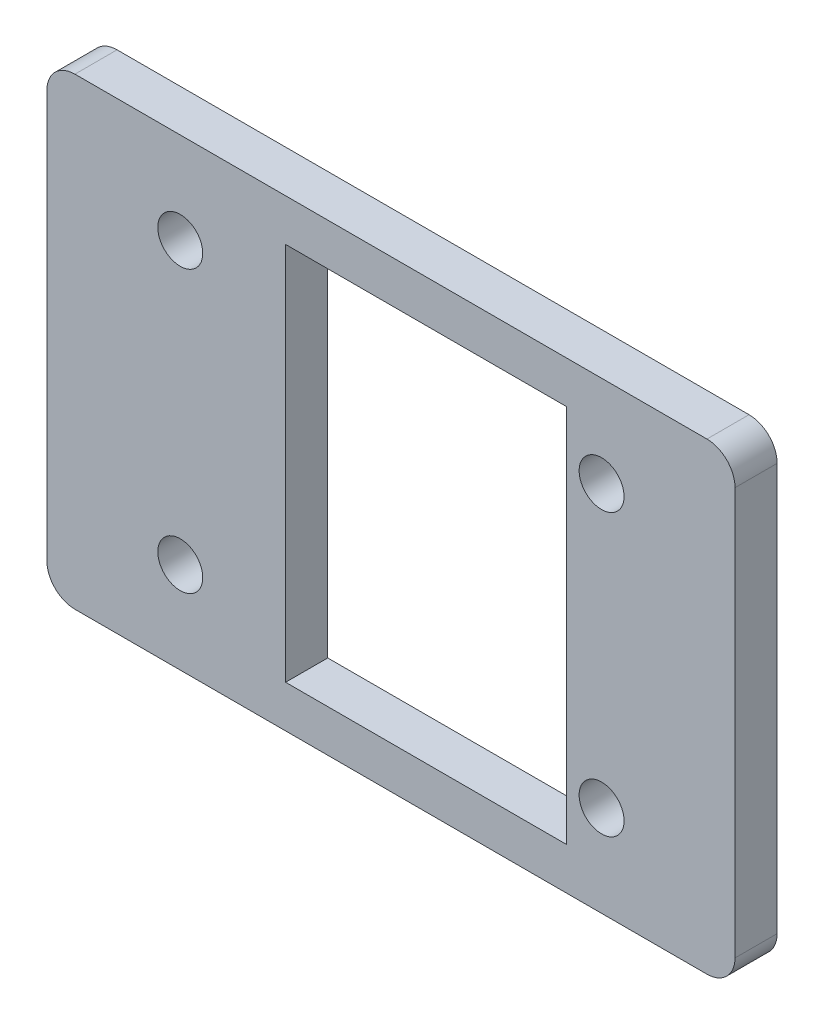
ISO-10303-21;
HEADER;
FILE_DESCRIPTION(('STEP AP214'),'2;1');
FILE_NAME('part.step','',(''),(''),'','','');
FILE_SCHEMA(('AUTOMOTIVE_DESIGN { 1 0 10303 214 1 1 1 1 }'));
ENDSEC;
DATA;
#1=APPLICATION_CONTEXT('core data for automotive mechanical design processes');
#2=APPLICATION_PROTOCOL_DEFINITION('international standard','automotive_design',2000,#1);
#3=PRODUCT_CONTEXT('',#1,'mechanical');
#4=PRODUCT('Part','Part','',(#3));
#5=PRODUCT_RELATED_PRODUCT_CATEGORY('part','',(#4));
#6=PRODUCT_DEFINITION_FORMATION('','',#4);
#7=PRODUCT_DEFINITION_CONTEXT('part definition',#1,'design');
#8=PRODUCT_DEFINITION('design','',#6,#7);
#9=PRODUCT_DEFINITION_SHAPE('','',#8);
#10=(LENGTH_UNIT() NAMED_UNIT(*) SI_UNIT(.MILLI.,.METRE.));
#11=(NAMED_UNIT(*) PLANE_ANGLE_UNIT() SI_UNIT($,.RADIAN.));
#12=(NAMED_UNIT(*) SI_UNIT($,.STERADIAN.) SOLID_ANGLE_UNIT());
#13=UNCERTAINTY_MEASURE_WITH_UNIT(LENGTH_MEASURE(1.E-05),#10,'distance_accuracy_value','');
#14=(GEOMETRIC_REPRESENTATION_CONTEXT(3) GLOBAL_UNCERTAINTY_ASSIGNED_CONTEXT((#13)) GLOBAL_UNIT_ASSIGNED_CONTEXT((#10,
#11,#12)) REPRESENTATION_CONTEXT('',''));
#15=CARTESIAN_POINT('',(0.,0.,0.));
#16=DIRECTION('',(0.,0.,1.));
#17=DIRECTION('',(1.,0.,0.));
#18=AXIS2_PLACEMENT_3D('',#15,#16,#17);
#19=CARTESIAN_POINT('',(0.,0.,3.));
#20=DIRECTION('',(0.,0.,1.));
#21=DIRECTION('',(1.,0.,0.));
#22=AXIS2_PLACEMENT_3D('',#19,#20,#21);
#23=PLANE('',#22);
#24=CARTESIAN_POINT('',(-9.6678520625889,-10.2418207681366,3.));
#25=DIRECTION('',(0.,0.,1.));
#26=DIRECTION('',(1.,0.,0.));
#27=AXIS2_PLACEMENT_3D('',#24,#25,#26);
#28=CIRCLE('',#27,1.6);
#29=CARTESIAN_POINT('',(-8.0678520625889,-10.2418207681366,3.));
#30=VERTEX_POINT('',#29);
#31=EDGE_CURVE('E154',#30,#30,#28,.T.);
#32=ORIENTED_EDGE('',*,*,#31,.F.);
#33=EDGE_LOOP('',(#32));
#34=FACE_BOUND('',#33,.T.);
#35=CARTESIAN_POINT('',(-9.6678520625889,9.75817923186344,3.));
#36=DIRECTION('',(0.,0.,1.));
#37=DIRECTION('',(1.,0.,0.));
#38=AXIS2_PLACEMENT_3D('',#35,#36,#37);
#39=CIRCLE('',#38,1.6);
#40=CARTESIAN_POINT('',(-8.0678520625889,9.75817923186344,3.));
#41=VERTEX_POINT('',#40);
#42=EDGE_CURVE('E166',#41,#41,#39,.T.);
#43=ORIENTED_EDGE('',*,*,#42,.F.);
#44=EDGE_LOOP('',(#43));
#45=FACE_BOUND('',#44,.T.);
#46=DIRECTION('',(0.,-1.,0.));
#47=VECTOR('',#46,1.);
#48=CARTESIAN_POINT('',(-19.1678520625889,16.2581792318634,3.));
#49=LINE('',#48,#47);
#50=CARTESIAN_POINT('',(-19.1678520625889,14.2581792318634,3.));
#51=VERTEX_POINT('',#50);
#52=CARTESIAN_POINT('',(-19.1678520625889,-14.7418207681366,3.));
#53=VERTEX_POINT('',#52);
#54=EDGE_CURVE('E172',#51,#53,#49,.T.);
#55=ORIENTED_EDGE('',*,*,#54,.T.);
#56=CARTESIAN_POINT('',(-17.1678520625889,-14.7418207681366,3.));
#57=DIRECTION('',(0.,0.,1.));
#58=DIRECTION('',(1.,0.,0.));
#59=AXIS2_PLACEMENT_3D('',#56,#57,#58);
#60=CIRCLE('',#59,2.);
#61=CARTESIAN_POINT('',(-17.1678520625889,-16.7418207681366,3.));
#62=VERTEX_POINT('',#61);
#63=EDGE_CURVE('E219',#53,#62,#60,.T.);
#64=ORIENTED_EDGE('',*,*,#63,.T.);
#65=DIRECTION('',(1.,0.,0.));
#66=VECTOR('',#65,1.);
#67=CARTESIAN_POINT('',(-19.1678520625889,-16.7418207681366,3.));
#68=LINE('',#67,#66);
#69=CARTESIAN_POINT('',(27.8321479374111,-16.7418207681366,3.));
#70=VERTEX_POINT('',#69);
#71=EDGE_CURVE('E175',#62,#70,#68,.T.);
#72=ORIENTED_EDGE('',*,*,#71,.T.);
#73=CARTESIAN_POINT('',(27.8321479374111,-14.7418207681366,3.));
#74=DIRECTION('',(0.,0.,1.));
#75=DIRECTION('',(1.,0.,0.));
#76=AXIS2_PLACEMENT_3D('',#73,#74,#75);
#77=CIRCLE('',#76,2.);
#78=CARTESIAN_POINT('',(29.8321479374111,-14.7418207681366,3.));
#79=VERTEX_POINT('',#78);
#80=EDGE_CURVE('E217',#70,#79,#77,.T.);
#81=ORIENTED_EDGE('',*,*,#80,.T.);
#82=DIRECTION('',(0.,1.,0.));
#83=VECTOR('',#82,1.);
#84=CARTESIAN_POINT('',(29.8321479374111,16.2581792318634,3.));
#85=LINE('',#84,#83);
#86=CARTESIAN_POINT('',(29.8321479374111,14.2581792318634,3.));
#87=VERTEX_POINT('',#86);
#88=EDGE_CURVE('E179',#79,#87,#85,.T.);
#89=ORIENTED_EDGE('',*,*,#88,.T.);
#90=CARTESIAN_POINT('',(27.8321479374111,14.2581792318634,3.));
#91=DIRECTION('',(0.,0.,1.));
#92=DIRECTION('',(1.,0.,0.));
#93=AXIS2_PLACEMENT_3D('',#90,#91,#92);
#94=CIRCLE('',#93,2.);
#95=CARTESIAN_POINT('',(27.8321479374111,16.2581792318634,3.));
#96=VERTEX_POINT('',#95);
#97=EDGE_CURVE('E215',#87,#96,#94,.T.);
#98=ORIENTED_EDGE('',*,*,#97,.T.);
#99=DIRECTION('',(-1.,0.,0.));
#100=VECTOR('',#99,1.);
#101=CARTESIAN_POINT('',(-19.1678520625889,16.2581792318634,3.));
#102=LINE('',#101,#100);
#103=CARTESIAN_POINT('',(-17.1678520625889,16.2581792318634,3.));
#104=VERTEX_POINT('',#103);
#105=EDGE_CURVE('E182',#96,#104,#102,.T.);
#106=ORIENTED_EDGE('',*,*,#105,.T.);
#107=CARTESIAN_POINT('',(-17.1678520625889,14.2581792318634,3.));
#108=DIRECTION('',(0.,0.,1.));
#109=DIRECTION('',(1.,0.,0.));
#110=AXIS2_PLACEMENT_3D('',#107,#108,#109);
#111=CIRCLE('',#110,2.);
#112=EDGE_CURVE('E213',#104,#51,#111,.T.);
#113=ORIENTED_EDGE('',*,*,#112,.T.);
#114=EDGE_LOOP('',(#55,#64,#72,#81,#89,#98,#106,#113));
#115=FACE_BOUND('',#114,.T.);
#116=CARTESIAN_POINT('',(20.3321479374111,9.75817923186344,3.));
#117=DIRECTION('',(0.,0.,1.));
#118=DIRECTION('',(1.,0.,0.));
#119=AXIS2_PLACEMENT_3D('',#116,#117,#118);
#120=CIRCLE('',#119,1.6);
#121=CARTESIAN_POINT('',(21.9321479374111,9.75817923186344,3.));
#122=VERTEX_POINT('',#121);
#123=EDGE_CURVE('E160',#122,#122,#120,.T.);
#124=ORIENTED_EDGE('',*,*,#123,.F.);
#125=EDGE_LOOP('',(#124));
#126=FACE_BOUND('',#125,.T.);
#127=CARTESIAN_POINT('',(20.3321479374111,-10.2418207681366,3.));
#128=DIRECTION('',(0.,0.,1.));
#129=DIRECTION('',(1.,0.,0.));
#130=AXIS2_PLACEMENT_3D('',#127,#128,#129);
#131=CIRCLE('',#130,1.6);
#132=CARTESIAN_POINT('',(21.9321479374111,-10.2418207681366,3.));
#133=VERTEX_POINT('',#132);
#134=EDGE_CURVE('E148',#133,#133,#131,.T.);
#135=ORIENTED_EDGE('',*,*,#134,.F.);
#136=EDGE_LOOP('',(#135));
#137=FACE_BOUND('',#136,.T.);
#138=DIRECTION('',(0.,-1.,0.));
#139=VECTOR('',#138,1.);
#140=CARTESIAN_POINT('',(17.8321479374111,13.2581792318634,3.));
#141=LINE('',#140,#139);
#142=CARTESIAN_POINT('',(17.8321479374111,13.2581792318634,3.));
#143=VERTEX_POINT('',#142);
#144=CARTESIAN_POINT('',(17.8321479374111,-13.7418207681366,3.));
#145=VERTEX_POINT('',#144);
#146=EDGE_CURVE('E139',#143,#145,#141,.T.);
#147=ORIENTED_EDGE('',*,*,#146,.T.);
#148=DIRECTION('',(-1.,0.,0.));
#149=VECTOR('',#148,1.);
#150=CARTESIAN_POINT('',(17.8321479374111,-13.7418207681366,3.));
#151=LINE('',#150,#149);
#152=CARTESIAN_POINT('',(-2.16785206258889,-13.7418207681366,3.));
#153=VERTEX_POINT('',#152);
#154=EDGE_CURVE('E48',#145,#153,#151,.T.);
#155=ORIENTED_EDGE('',*,*,#154,.T.);
#156=DIRECTION('',(0.,-1.,0.));
#157=VECTOR('',#156,1.);
#158=CARTESIAN_POINT('',(-2.16785206258889,13.2581792318634,3.));
#159=LINE('',#158,#157);
#160=CARTESIAN_POINT('',(-2.16785206258889,13.2581792318634,3.));
#161=VERTEX_POINT('',#160);
#162=EDGE_CURVE('E130',#161,#153,#159,.T.);
#163=ORIENTED_EDGE('',*,*,#162,.F.);
#164=DIRECTION('',(-1.,0.,0.));
#165=VECTOR('',#164,1.);
#166=CARTESIAN_POINT('',(17.8321479374111,13.2581792318634,3.));
#167=LINE('',#166,#165);
#168=EDGE_CURVE('E136',#143,#161,#167,.T.);
#169=ORIENTED_EDGE('',*,*,#168,.F.);
#170=EDGE_LOOP('',(#147,#155,#163,#169));
#171=FACE_BOUND('',#170,.T.);
#172=ADVANCED_FACE('F33',(#34,#45,#115,#126,#137,#171),#23,.T.);
#173=CARTESIAN_POINT('',(0.,0.,0.));
#174=DIRECTION('',(0.,0.,1.));
#175=DIRECTION('',(1.,0.,0.));
#176=AXIS2_PLACEMENT_3D('',#173,#174,#175);
#177=PLANE('',#176);
#178=CARTESIAN_POINT('',(20.3321479374111,-10.2418207681366,0.));
#179=DIRECTION('',(0.,0.,1.));
#180=DIRECTION('',(1.,0.,0.));
#181=AXIS2_PLACEMENT_3D('',#178,#179,#180);
#182=CIRCLE('',#181,1.6);
#183=CARTESIAN_POINT('',(21.9321479374111,-10.2418207681366,0.));
#184=VERTEX_POINT('',#183);
#185=EDGE_CURVE('E126',#184,#184,#182,.T.);
#186=ORIENTED_EDGE('',*,*,#185,.T.);
#187=EDGE_LOOP('',(#186));
#188=FACE_BOUND('',#187,.T.);
#189=CARTESIAN_POINT('',(-9.6678520625889,-10.2418207681366,0.));
#190=DIRECTION('',(0.,0.,1.));
#191=DIRECTION('',(1.,0.,0.));
#192=AXIS2_PLACEMENT_3D('',#189,#190,#191);
#193=CIRCLE('',#192,1.6);
#194=CARTESIAN_POINT('',(-8.0678520625889,-10.2418207681366,0.));
#195=VERTEX_POINT('',#194);
#196=EDGE_CURVE('E151',#195,#195,#193,.T.);
#197=ORIENTED_EDGE('',*,*,#196,.T.);
#198=EDGE_LOOP('',(#197));
#199=FACE_BOUND('',#198,.T.);
#200=CARTESIAN_POINT('',(20.3321479374111,9.75817923186344,0.));
#201=DIRECTION('',(0.,0.,1.));
#202=DIRECTION('',(1.,0.,0.));
#203=AXIS2_PLACEMENT_3D('',#200,#201,#202);
#204=CIRCLE('',#203,1.6);
#205=CARTESIAN_POINT('',(21.9321479374111,9.75817923186344,0.));
#206=VERTEX_POINT('',#205);
#207=EDGE_CURVE('E157',#206,#206,#204,.T.);
#208=ORIENTED_EDGE('',*,*,#207,.T.);
#209=EDGE_LOOP('',(#208));
#210=FACE_BOUND('',#209,.T.);
#211=CARTESIAN_POINT('',(-9.6678520625889,9.75817923186344,0.));
#212=DIRECTION('',(0.,0.,1.));
#213=DIRECTION('',(1.,0.,0.));
#214=AXIS2_PLACEMENT_3D('',#211,#212,#213);
#215=CIRCLE('',#214,1.6);
#216=CARTESIAN_POINT('',(-8.0678520625889,9.75817923186344,0.));
#217=VERTEX_POINT('',#216);
#218=EDGE_CURVE('E163',#217,#217,#215,.T.);
#219=ORIENTED_EDGE('',*,*,#218,.T.);
#220=EDGE_LOOP('',(#219));
#221=FACE_BOUND('',#220,.T.);
#222=DIRECTION('',(1.,0.,0.));
#223=VECTOR('',#222,1.);
#224=CARTESIAN_POINT('',(-19.1678520625889,-16.7418207681366,0.));
#225=LINE('',#224,#223);
#226=CARTESIAN_POINT('',(-17.1678520625889,-16.7418207681366,0.));
#227=VERTEX_POINT('',#226);
#228=CARTESIAN_POINT('',(27.8321479374111,-16.7418207681366,0.));
#229=VERTEX_POINT('',#228);
#230=EDGE_CURVE('E188',#227,#229,#225,.T.);
#231=ORIENTED_EDGE('',*,*,#230,.F.);
#232=CARTESIAN_POINT('',(-17.1678520625889,-14.7418207681366,0.));
#233=DIRECTION('',(0.,0.,1.));
#234=DIRECTION('',(1.,0.,0.));
#235=AXIS2_PLACEMENT_3D('',#232,#233,#234);
#236=CIRCLE('',#235,2.);
#237=CARTESIAN_POINT('',(-19.1678520625889,-14.7418207681366,0.));
#238=VERTEX_POINT('',#237);
#239=EDGE_CURVE('E206',#227,#238,#236,.F.);
#240=ORIENTED_EDGE('',*,*,#239,.T.);
#241=DIRECTION('',(0.,-1.,0.));
#242=VECTOR('',#241,1.);
#243=CARTESIAN_POINT('',(-19.1678520625889,16.2581792318634,0.));
#244=LINE('',#243,#242);
#245=CARTESIAN_POINT('',(-19.1678520625889,14.2581792318634,0.));
#246=VERTEX_POINT('',#245);
#247=EDGE_CURVE('E169',#246,#238,#244,.T.);
#248=ORIENTED_EDGE('',*,*,#247,.F.);
#249=CARTESIAN_POINT('',(-17.1678520625889,14.2581792318634,0.));
#250=DIRECTION('',(0.,0.,1.));
#251=DIRECTION('',(1.,0.,0.));
#252=AXIS2_PLACEMENT_3D('',#249,#250,#251);
#253=CIRCLE('',#252,2.);
#254=CARTESIAN_POINT('',(-17.1678520625889,16.2581792318634,0.));
#255=VERTEX_POINT('',#254);
#256=EDGE_CURVE('E200',#246,#255,#253,.F.);
#257=ORIENTED_EDGE('',*,*,#256,.T.);
#258=DIRECTION('',(-1.,0.,0.));
#259=VECTOR('',#258,1.);
#260=CARTESIAN_POINT('',(-19.1678520625889,16.2581792318634,0.));
#261=LINE('',#260,#259);
#262=CARTESIAN_POINT('',(27.8321479374111,16.2581792318634,0.));
#263=VERTEX_POINT('',#262);
#264=EDGE_CURVE('E176',#263,#255,#261,.T.);
#265=ORIENTED_EDGE('',*,*,#264,.F.);
#266=CARTESIAN_POINT('',(27.8321479374111,14.2581792318634,0.));
#267=DIRECTION('',(0.,0.,1.));
#268=DIRECTION('',(1.,0.,0.));
#269=AXIS2_PLACEMENT_3D('',#266,#267,#268);
#270=CIRCLE('',#269,2.);
#271=CARTESIAN_POINT('',(29.8321479374111,14.2581792318634,0.));
#272=VERTEX_POINT('',#271);
#273=EDGE_CURVE('E202',#263,#272,#270,.F.);
#274=ORIENTED_EDGE('',*,*,#273,.T.);
#275=DIRECTION('',(0.,1.,0.));
#276=VECTOR('',#275,1.);
#277=CARTESIAN_POINT('',(29.8321479374111,16.2581792318634,0.));
#278=LINE('',#277,#276);
#279=CARTESIAN_POINT('',(29.8321479374111,-14.7418207681366,0.));
#280=VERTEX_POINT('',#279);
#281=EDGE_CURVE('E191',#280,#272,#278,.T.);
#282=ORIENTED_EDGE('',*,*,#281,.F.);
#283=CARTESIAN_POINT('',(27.8321479374111,-14.7418207681366,0.));
#284=DIRECTION('',(0.,0.,1.));
#285=DIRECTION('',(1.,0.,0.));
#286=AXIS2_PLACEMENT_3D('',#283,#284,#285);
#287=CIRCLE('',#286,2.);
#288=EDGE_CURVE('E204',#280,#229,#287,.F.);
#289=ORIENTED_EDGE('',*,*,#288,.T.);
#290=EDGE_LOOP('',(#231,#240,#248,#257,#265,#274,#282,#289));
#291=FACE_BOUND('',#290,.T.);
#292=DIRECTION('',(-1.,0.,0.));
#293=VECTOR('',#292,1.);
#294=CARTESIAN_POINT('',(0.,-13.7418207681366,0.));
#295=LINE('',#294,#293);
#296=CARTESIAN_POINT('',(17.8321479374111,-13.7418207681366,0.));
#297=VERTEX_POINT('',#296);
#298=CARTESIAN_POINT('',(-2.16785206258889,-13.7418207681366,0.));
#299=VERTEX_POINT('',#298);
#300=EDGE_CURVE('E11',#297,#299,#295,.T.);
#301=ORIENTED_EDGE('',*,*,#300,.F.);
#302=DIRECTION('',(0.,-1.,0.));
#303=VECTOR('',#302,1.);
#304=CARTESIAN_POINT('',(17.8321479374111,0.,0.));
#305=LINE('',#304,#303);
#306=CARTESIAN_POINT('',(17.8321479374111,13.2581792318634,0.));
#307=VERTEX_POINT('',#306);
#308=EDGE_CURVE('E231',#307,#297,#305,.T.);
#309=ORIENTED_EDGE('',*,*,#308,.F.);
#310=DIRECTION('',(-1.,0.,0.));
#311=VECTOR('',#310,1.);
#312=CARTESIAN_POINT('',(0.,13.2581792318634,0.));
#313=LINE('',#312,#311);
#314=CARTESIAN_POINT('',(-2.16785206258889,13.2581792318634,0.));
#315=VERTEX_POINT('',#314);
#316=EDGE_CURVE('E233',#307,#315,#313,.T.);
#317=ORIENTED_EDGE('',*,*,#316,.T.);
#318=DIRECTION('',(0.,-1.,0.));
#319=VECTOR('',#318,1.);
#320=CARTESIAN_POINT('',(-2.16785206258889,0.,0.));
#321=LINE('',#320,#319);
#322=EDGE_CURVE('E41',#315,#299,#321,.T.);
#323=ORIENTED_EDGE('',*,*,#322,.T.);
#324=EDGE_LOOP('',(#301,#309,#317,#323));
#325=FACE_BOUND('',#324,.T.);
#326=ADVANCED_FACE('F236',(#188,#199,#210,#221,#291,#325),#177,.F.);
#327=CARTESIAN_POINT('',(-19.1678520625889,16.2581792318634,3.));
#328=DIRECTION('',(1.,0.,0.));
#329=DIRECTION('',(0.,0.,-1.));
#330=AXIS2_PLACEMENT_3D('',#327,#328,#329);
#331=PLANE('',#330);
#332=ORIENTED_EDGE('',*,*,#247,.T.);
#333=DIRECTION('',(0.,0.,-1.));
#334=VECTOR('',#333,1.);
#335=CARTESIAN_POINT('',(-19.1678520625889,-14.7418207681366,3.));
#336=LINE('',#335,#334);
#337=EDGE_CURVE('E211',#238,#53,#336,.F.);
#338=ORIENTED_EDGE('',*,*,#337,.T.);
#339=ORIENTED_EDGE('',*,*,#54,.F.);
#340=DIRECTION('',(0.,0.,-1.));
#341=VECTOR('',#340,1.);
#342=CARTESIAN_POINT('',(-19.1678520625889,14.2581792318634,3.));
#343=LINE('',#342,#341);
#344=EDGE_CURVE('E208',#51,#246,#343,.T.);
#345=ORIENTED_EDGE('',*,*,#344,.T.);
#346=EDGE_LOOP('',(#332,#338,#339,#345));
#347=FACE_BOUND('',#346,.T.);
#348=ADVANCED_FACE('F253',(#347),#331,.F.);
#349=CARTESIAN_POINT('',(-19.1678520625889,-16.7418207681366,3.));
#350=DIRECTION('',(0.,1.,0.));
#351=DIRECTION('',(0.,0.,1.));
#352=AXIS2_PLACEMENT_3D('',#349,#350,#351);
#353=PLANE('',#352);
#354=ORIENTED_EDGE('',*,*,#71,.F.);
#355=DIRECTION('',(0.,0.,-1.));
#356=VECTOR('',#355,1.);
#357=CARTESIAN_POINT('',(-17.1678520625889,-16.7418207681366,3.));
#358=LINE('',#357,#356);
#359=EDGE_CURVE('E197',#62,#227,#358,.T.);
#360=ORIENTED_EDGE('',*,*,#359,.T.);
#361=ORIENTED_EDGE('',*,*,#230,.T.);
#362=DIRECTION('',(0.,0.,-1.));
#363=VECTOR('',#362,1.);
#364=CARTESIAN_POINT('',(27.8321479374111,-16.7418207681366,3.));
#365=LINE('',#364,#363);
#366=EDGE_CURVE('E185',#229,#70,#365,.F.);
#367=ORIENTED_EDGE('',*,*,#366,.T.);
#368=EDGE_LOOP('',(#354,#360,#361,#367));
#369=FACE_BOUND('',#368,.T.);
#370=ADVANCED_FACE('F269',(#369),#353,.F.);
#371=CARTESIAN_POINT('',(29.8321479374111,16.2581792318634,3.));
#372=DIRECTION('',(-1.,0.,0.));
#373=DIRECTION('',(0.,-1.,0.));
#374=AXIS2_PLACEMENT_3D('',#371,#372,#373);
#375=PLANE('',#374);
#376=ORIENTED_EDGE('',*,*,#88,.F.);
#377=DIRECTION('',(0.,0.,-1.));
#378=VECTOR('',#377,1.);
#379=CARTESIAN_POINT('',(29.8321479374111,-14.7418207681366,3.));
#380=LINE('',#379,#378);
#381=EDGE_CURVE('E223',#79,#280,#380,.T.);
#382=ORIENTED_EDGE('',*,*,#381,.T.);
#383=ORIENTED_EDGE('',*,*,#281,.T.);
#384=DIRECTION('',(0.,0.,-1.));
#385=VECTOR('',#384,1.);
#386=CARTESIAN_POINT('',(29.8321479374111,14.2581792318634,3.));
#387=LINE('',#386,#385);
#388=EDGE_CURVE('E221',#272,#87,#387,.F.);
#389=ORIENTED_EDGE('',*,*,#388,.T.);
#390=EDGE_LOOP('',(#376,#382,#383,#389));
#391=FACE_BOUND('',#390,.T.);
#392=ADVANCED_FACE('F265',(#391),#375,.F.);
#393=CARTESIAN_POINT('',(-19.1678520625889,16.2581792318634,3.));
#394=DIRECTION('',(0.,-1.,0.));
#395=DIRECTION('',(0.,0.,-1.));
#396=AXIS2_PLACEMENT_3D('',#393,#394,#395);
#397=PLANE('',#396);
#398=ORIENTED_EDGE('',*,*,#105,.F.);
#399=DIRECTION('',(0.,0.,-1.));
#400=VECTOR('',#399,1.);
#401=CARTESIAN_POINT('',(27.8321479374111,16.2581792318634,3.));
#402=LINE('',#401,#400);
#403=EDGE_CURVE('E228',#96,#263,#402,.T.);
#404=ORIENTED_EDGE('',*,*,#403,.T.);
#405=ORIENTED_EDGE('',*,*,#264,.T.);
#406=DIRECTION('',(0.,0.,-1.));
#407=VECTOR('',#406,1.);
#408=CARTESIAN_POINT('',(-17.1678520625889,16.2581792318634,3.));
#409=LINE('',#408,#407);
#410=EDGE_CURVE('E226',#255,#104,#409,.F.);
#411=ORIENTED_EDGE('',*,*,#410,.T.);
#412=EDGE_LOOP('',(#398,#404,#405,#411));
#413=FACE_BOUND('',#412,.T.);
#414=ADVANCED_FACE('F262',(#413),#397,.F.);
#415=CARTESIAN_POINT('',(-9.6678520625889,9.75817923186344,3.));
#416=DIRECTION('',(0.,0.,-1.));
#417=DIRECTION('',(-1.,0.,0.));
#418=AXIS2_PLACEMENT_3D('',#415,#416,#417);
#419=CYLINDRICAL_SURFACE('',#418,1.6);
#420=ORIENTED_EDGE('',*,*,#42,.T.);
#421=EDGE_LOOP('',(#420));
#422=FACE_BOUND('',#421,.T.);
#423=ORIENTED_EDGE('',*,*,#218,.F.);
#424=EDGE_LOOP('',(#423));
#425=FACE_BOUND('',#424,.T.);
#426=ADVANCED_FACE('F259',(#422,#425),#419,.F.);
#427=CARTESIAN_POINT('',(20.3321479374111,9.75817923186344,3.));
#428=DIRECTION('',(0.,0.,-1.));
#429=DIRECTION('',(-1.,0.,0.));
#430=AXIS2_PLACEMENT_3D('',#427,#428,#429);
#431=CYLINDRICAL_SURFACE('',#430,1.6);
#432=ORIENTED_EDGE('',*,*,#123,.T.);
#433=EDGE_LOOP('',(#432));
#434=FACE_BOUND('',#433,.T.);
#435=ORIENTED_EDGE('',*,*,#207,.F.);
#436=EDGE_LOOP('',(#435));
#437=FACE_BOUND('',#436,.T.);
#438=ADVANCED_FACE('F332',(#434,#437),#431,.F.);
#439=CARTESIAN_POINT('',(-9.6678520625889,-10.2418207681366,3.));
#440=DIRECTION('',(0.,0.,-1.));
#441=DIRECTION('',(-1.,0.,0.));
#442=AXIS2_PLACEMENT_3D('',#439,#440,#441);
#443=CYLINDRICAL_SURFACE('',#442,1.6);
#444=ORIENTED_EDGE('',*,*,#31,.T.);
#445=EDGE_LOOP('',(#444));
#446=FACE_BOUND('',#445,.T.);
#447=ORIENTED_EDGE('',*,*,#196,.F.);
#448=EDGE_LOOP('',(#447));
#449=FACE_BOUND('',#448,.T.);
#450=ADVANCED_FACE('F321',(#446,#449),#443,.F.);
#451=CARTESIAN_POINT('',(20.3321479374111,-10.2418207681366,3.));
#452=DIRECTION('',(0.,0.,-1.));
#453=DIRECTION('',(-1.,0.,0.));
#454=AXIS2_PLACEMENT_3D('',#451,#452,#453);
#455=CYLINDRICAL_SURFACE('',#454,1.6);
#456=ORIENTED_EDGE('',*,*,#134,.T.);
#457=EDGE_LOOP('',(#456));
#458=FACE_BOUND('',#457,.T.);
#459=ORIENTED_EDGE('',*,*,#185,.F.);
#460=EDGE_LOOP('',(#459));
#461=FACE_BOUND('',#460,.T.);
#462=ADVANCED_FACE('F281',(#458,#461),#455,.F.);
#463=CARTESIAN_POINT('',(-17.1678520625889,-14.7418207681366,3.));
#464=DIRECTION('',(0.,0.,-1.));
#465=DIRECTION('',(-1.,0.,0.));
#466=AXIS2_PLACEMENT_3D('',#463,#464,#465);
#467=CYLINDRICAL_SURFACE('',#466,2.);
#468=ORIENTED_EDGE('',*,*,#63,.F.);
#469=ORIENTED_EDGE('',*,*,#337,.F.);
#470=ORIENTED_EDGE('',*,*,#239,.F.);
#471=ORIENTED_EDGE('',*,*,#359,.F.);
#472=EDGE_LOOP('',(#468,#469,#470,#471));
#473=FACE_BOUND('',#472,.T.);
#474=ADVANCED_FACE('F277',(#473),#467,.T.);
#475=CARTESIAN_POINT('',(27.8321479374111,-14.7418207681366,3.));
#476=DIRECTION('',(0.,0.,-1.));
#477=DIRECTION('',(-1.,0.,0.));
#478=AXIS2_PLACEMENT_3D('',#475,#476,#477);
#479=CYLINDRICAL_SURFACE('',#478,2.);
#480=ORIENTED_EDGE('',*,*,#80,.F.);
#481=ORIENTED_EDGE('',*,*,#366,.F.);
#482=ORIENTED_EDGE('',*,*,#288,.F.);
#483=ORIENTED_EDGE('',*,*,#381,.F.);
#484=EDGE_LOOP('',(#480,#481,#482,#483));
#485=FACE_BOUND('',#484,.T.);
#486=ADVANCED_FACE('F280',(#485),#479,.T.);
#487=CARTESIAN_POINT('',(27.8321479374111,14.2581792318634,3.));
#488=DIRECTION('',(0.,0.,-1.));
#489=DIRECTION('',(-1.,0.,0.));
#490=AXIS2_PLACEMENT_3D('',#487,#488,#489);
#491=CYLINDRICAL_SURFACE('',#490,2.);
#492=ORIENTED_EDGE('',*,*,#97,.F.);
#493=ORIENTED_EDGE('',*,*,#388,.F.);
#494=ORIENTED_EDGE('',*,*,#273,.F.);
#495=ORIENTED_EDGE('',*,*,#403,.F.);
#496=EDGE_LOOP('',(#492,#493,#494,#495));
#497=FACE_BOUND('',#496,.T.);
#498=ADVANCED_FACE('F284',(#497),#491,.T.);
#499=CARTESIAN_POINT('',(-17.1678520625889,14.2581792318634,3.));
#500=DIRECTION('',(0.,0.,-1.));
#501=DIRECTION('',(-1.,0.,0.));
#502=AXIS2_PLACEMENT_3D('',#499,#500,#501);
#503=CYLINDRICAL_SURFACE('',#502,2.);
#504=ORIENTED_EDGE('',*,*,#112,.F.);
#505=ORIENTED_EDGE('',*,*,#410,.F.);
#506=ORIENTED_EDGE('',*,*,#256,.F.);
#507=ORIENTED_EDGE('',*,*,#344,.F.);
#508=EDGE_LOOP('',(#504,#505,#506,#507));
#509=FACE_BOUND('',#508,.T.);
#510=ADVANCED_FACE('F35',(#509),#503,.T.);
#511=CARTESIAN_POINT('',(17.8321479374111,-13.7418207681366,-7.));
#512=DIRECTION('',(0.,1.,0.));
#513=DIRECTION('',(-1.,0.,0.));
#514=AXIS2_PLACEMENT_3D('',#511,#512,#513);
#515=PLANE('',#514);
#516=ORIENTED_EDGE('',*,*,#300,.T.);
#517=DIRECTION('',(0.,0.,1.));
#518=VECTOR('',#517,1.);
#519=CARTESIAN_POINT('',(-2.16785206258889,-13.7418207681366,-7.));
#520=LINE('',#519,#518);
#521=EDGE_CURVE('E120',#299,#153,#520,.T.);
#522=ORIENTED_EDGE('',*,*,#521,.T.);
#523=ORIENTED_EDGE('',*,*,#154,.F.);
#524=DIRECTION('',(0.,0.,1.));
#525=VECTOR('',#524,1.);
#526=CARTESIAN_POINT('',(17.8321479374111,-13.7418207681366,-7.));
#527=LINE('',#526,#525);
#528=EDGE_CURVE('E144',#297,#145,#527,.T.);
#529=ORIENTED_EDGE('',*,*,#528,.F.);
#530=EDGE_LOOP('',(#516,#522,#523,#529));
#531=FACE_BOUND('',#530,.T.);
#532=ADVANCED_FACE('F122',(#531),#515,.T.);
#533=CARTESIAN_POINT('',(-2.16785206258889,13.2581792318634,-7.));
#534=DIRECTION('',(-1.,0.,0.));
#535=DIRECTION('',(0.,-1.,0.));
#536=AXIS2_PLACEMENT_3D('',#533,#534,#535);
#537=PLANE('',#536);
#538=DIRECTION('',(0.,0.,1.));
#539=VECTOR('',#538,1.);
#540=CARTESIAN_POINT('',(-2.16785206258889,13.2581792318634,-7.));
#541=LINE('',#540,#539);
#542=EDGE_CURVE('E127',#315,#161,#541,.T.);
#543=ORIENTED_EDGE('',*,*,#542,.T.);
#544=ORIENTED_EDGE('',*,*,#162,.T.);
#545=ORIENTED_EDGE('',*,*,#521,.F.);
#546=ORIENTED_EDGE('',*,*,#322,.F.);
#547=EDGE_LOOP('',(#543,#544,#545,#546));
#548=FACE_BOUND('',#547,.T.);
#549=ADVANCED_FACE('F131',(#548),#537,.F.);
#550=CARTESIAN_POINT('',(17.8321479374111,13.2581792318634,-7.));
#551=DIRECTION('',(0.,1.,0.));
#552=DIRECTION('',(-1.,0.,0.));
#553=AXIS2_PLACEMENT_3D('',#550,#551,#552);
#554=PLANE('',#553);
#555=DIRECTION('',(0.,0.,1.));
#556=VECTOR('',#555,1.);
#557=CARTESIAN_POINT('',(17.8321479374111,13.2581792318634,-7.));
#558=LINE('',#557,#556);
#559=EDGE_CURVE('E56',#307,#143,#558,.T.);
#560=ORIENTED_EDGE('',*,*,#559,.T.);
#561=ORIENTED_EDGE('',*,*,#168,.T.);
#562=ORIENTED_EDGE('',*,*,#542,.F.);
#563=ORIENTED_EDGE('',*,*,#316,.F.);
#564=EDGE_LOOP('',(#560,#561,#562,#563));
#565=FACE_BOUND('',#564,.T.);
#566=ADVANCED_FACE('F239',(#565),#554,.F.);
#567=CARTESIAN_POINT('',(17.8321479374111,13.2581792318634,-7.));
#568=DIRECTION('',(-1.,0.,0.));
#569=DIRECTION('',(0.,-1.,0.));
#570=AXIS2_PLACEMENT_3D('',#567,#568,#569);
#571=PLANE('',#570);
#572=ORIENTED_EDGE('',*,*,#308,.T.);
#573=ORIENTED_EDGE('',*,*,#528,.T.);
#574=ORIENTED_EDGE('',*,*,#146,.F.);
#575=ORIENTED_EDGE('',*,*,#559,.F.);
#576=EDGE_LOOP('',(#572,#573,#574,#575));
#577=FACE_BOUND('',#576,.T.);
#578=ADVANCED_FACE('F240',(#577),#571,.T.);
#579=CLOSED_SHELL('',(#172,#326,#348,#370,#392,#414,#426,#438,#450,#462,#474,#486,#498,#510,
#532,#549,#566,#578));
#580=MANIFOLD_SOLID_BREP('B2',#579);
#581=ADVANCED_BREP_SHAPE_REPRESENTATION('',(#18,#580),#14);
#582=SHAPE_DEFINITION_REPRESENTATION(#9,#581);
ENDSEC;
END-ISO-10303-21;
